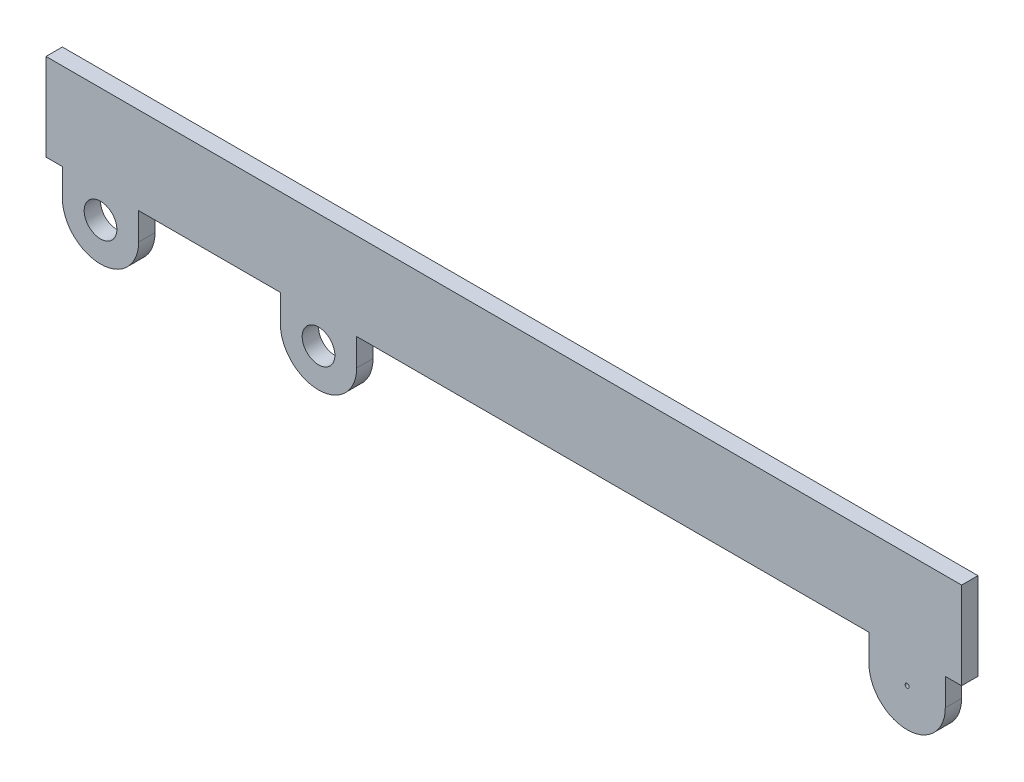
ISO-10303-21;
HEADER;
FILE_DESCRIPTION(('STEP AP214'),'2;1');
FILE_NAME('part.step','',(''),(''),'','','');
FILE_SCHEMA(('AUTOMOTIVE_DESIGN { 1 0 10303 214 1 1 1 1 }'));
ENDSEC;
DATA;
#1=APPLICATION_CONTEXT('core data for automotive mechanical design processes');
#2=APPLICATION_PROTOCOL_DEFINITION('international standard','automotive_design',2000,#1);
#3=PRODUCT_CONTEXT('',#1,'mechanical');
#4=PRODUCT('Part','Part','',(#3));
#5=PRODUCT_RELATED_PRODUCT_CATEGORY('part','',(#4));
#6=PRODUCT_DEFINITION_FORMATION('','',#4);
#7=PRODUCT_DEFINITION_CONTEXT('part definition',#1,'design');
#8=PRODUCT_DEFINITION('design','',#6,#7);
#9=PRODUCT_DEFINITION_SHAPE('','',#8);
#10=(LENGTH_UNIT() NAMED_UNIT(*) SI_UNIT(.MILLI.,.METRE.));
#11=(NAMED_UNIT(*) PLANE_ANGLE_UNIT() SI_UNIT($,.RADIAN.));
#12=(NAMED_UNIT(*) SI_UNIT($,.STERADIAN.) SOLID_ANGLE_UNIT());
#13=UNCERTAINTY_MEASURE_WITH_UNIT(LENGTH_MEASURE(1.E-05),#10,'distance_accuracy_value','');
#14=(GEOMETRIC_REPRESENTATION_CONTEXT(3) GLOBAL_UNCERTAINTY_ASSIGNED_CONTEXT((#13)) GLOBAL_UNIT_ASSIGNED_CONTEXT((#10,
#11,#12)) REPRESENTATION_CONTEXT('',''));
#15=CARTESIAN_POINT('',(0.,0.,0.));
#16=DIRECTION('',(0.,0.,1.));
#17=DIRECTION('',(1.,0.,0.));
#18=AXIS2_PLACEMENT_3D('',#15,#16,#17);
#19=CARTESIAN_POINT('',(469.9,-82.5500000000001,-117.08821460762));
#20=DIRECTION('',(0.,0.,1.));
#21=DIRECTION('',(1.,0.,0.));
#22=AXIS2_PLACEMENT_3D('',#19,#20,#21);
#23=CYLINDRICAL_SURFACE('',#22,2.38125);
#24=CARTESIAN_POINT('',(469.9,-82.5500000000001,19.05));
#25=DIRECTION('',(0.,0.,1.));
#26=DIRECTION('',(1.,0.,0.));
#27=AXIS2_PLACEMENT_3D('',#24,#25,#26);
#28=CIRCLE('',#27,2.38125);
#29=CARTESIAN_POINT('',(472.28125,-82.5500000000001,19.05));
#30=VERTEX_POINT('',#29);
#31=EDGE_CURVE('E212',#30,#30,#28,.T.);
#32=ORIENTED_EDGE('',*,*,#31,.T.);
#33=EDGE_LOOP('',(#32));
#34=FACE_BOUND('',#33,.T.);
#35=CARTESIAN_POINT('',(469.9,-82.5500000000001,9.52499999999999));
#36=DIRECTION('',(0.,0.,-1.));
#37=DIRECTION('',(-1.,0.,0.));
#38=AXIS2_PLACEMENT_3D('',#35,#36,#37);
#39=CIRCLE('',#38,2.38125);
#40=CARTESIAN_POINT('',(467.51875,-82.5500000000001,9.52499999999999));
#41=VERTEX_POINT('',#40);
#42=EDGE_CURVE('E43',#41,#41,#39,.F.);
#43=ORIENTED_EDGE('',*,*,#42,.F.);
#44=EDGE_LOOP('',(#43));
#45=FACE_BOUND('',#44,.T.);
#46=ADVANCED_FACE('F39',(#34,#45),#23,.F.);
#47=CARTESIAN_POINT('',(-533.4,-50.8,19.05));
#48=DIRECTION('',(0.,1.,0.));
#49=DIRECTION('',(0.,0.,1.));
#50=AXIS2_PLACEMENT_3D('',#47,#48,#49);
#51=PLANE('',#50);
#52=DIRECTION('',(1.,0.,0.));
#53=VECTOR('',#52,1.);
#54=CARTESIAN_POINT('',(-533.4,-50.8,0.));
#55=LINE('',#54,#53);
#56=CARTESIAN_POINT('',(-425.45,-50.8,0.));
#57=VERTEX_POINT('',#56);
#58=CARTESIAN_POINT('',(-260.35,-50.8,0.));
#59=VERTEX_POINT('',#58);
#60=EDGE_CURVE('E316',#57,#59,#55,.T.);
#61=ORIENTED_EDGE('',*,*,#60,.T.);
#62=DIRECTION('',(0.,0.,1.));
#63=VECTOR('',#62,1.);
#64=CARTESIAN_POINT('',(-260.35,-50.8,-117.08821460762));
#65=LINE('',#64,#63);
#66=CARTESIAN_POINT('',(-260.35,-50.8,19.05));
#67=VERTEX_POINT('',#66);
#68=EDGE_CURVE('E64',#59,#67,#65,.T.);
#69=ORIENTED_EDGE('',*,*,#68,.T.);
#70=DIRECTION('',(1.,0.,0.));
#71=VECTOR('',#70,1.);
#72=CARTESIAN_POINT('',(-533.4,-50.8,19.05));
#73=LINE('',#72,#71);
#74=CARTESIAN_POINT('',(-425.45,-50.8,19.05));
#75=VERTEX_POINT('',#74);
#76=EDGE_CURVE('E302',#75,#67,#73,.T.);
#77=ORIENTED_EDGE('',*,*,#76,.F.);
#78=DIRECTION('',(0.,0.,1.));
#79=VECTOR('',#78,1.);
#80=CARTESIAN_POINT('',(-425.45,-50.8,-117.08821460762));
#81=LINE('',#80,#79);
#82=EDGE_CURVE('E267',#57,#75,#81,.T.);
#83=ORIENTED_EDGE('',*,*,#82,.F.);
#84=EDGE_LOOP('',(#61,#69,#77,#83));
#85=FACE_BOUND('',#84,.T.);
#86=ADVANCED_FACE('F367',(#85),#51,.F.);
#87=CARTESIAN_POINT('',(514.35,-50.8,19.05));
#88=VERTEX_POINT('',#87);
#89=CARTESIAN_POINT('',(533.4,-50.8,19.05));
#90=VERTEX_POINT('',#89);
#91=EDGE_CURVE('E296',#88,#90,#73,.T.);
#92=ORIENTED_EDGE('',*,*,#91,.F.);
#93=DIRECTION('',(0.,0.,1.));
#94=VECTOR('',#93,1.);
#95=CARTESIAN_POINT('',(514.35,-50.8,-117.08821460762));
#96=LINE('',#95,#94);
#97=CARTESIAN_POINT('',(514.35,-50.8,0.));
#98=VERTEX_POINT('',#97);
#99=EDGE_CURVE('E221',#98,#88,#96,.T.);
#100=ORIENTED_EDGE('',*,*,#99,.F.);
#101=CARTESIAN_POINT('',(533.4,-50.8,0.));
#102=VERTEX_POINT('',#101);
#103=EDGE_CURVE('E312',#98,#102,#55,.T.);
#104=ORIENTED_EDGE('',*,*,#103,.T.);
#105=DIRECTION('',(0.,0.,-1.));
#106=VECTOR('',#105,1.);
#107=CARTESIAN_POINT('',(533.4,-50.8,19.05));
#108=LINE('',#107,#106);
#109=EDGE_CURVE('E301',#90,#102,#108,.T.);
#110=ORIENTED_EDGE('',*,*,#109,.F.);
#111=EDGE_LOOP('',(#92,#100,#104,#110));
#112=FACE_BOUND('',#111,.T.);
#113=ADVANCED_FACE('F350',(#112),#51,.F.);
#114=CARTESIAN_POINT('',(-171.45,-50.8,19.05));
#115=VERTEX_POINT('',#114);
#116=CARTESIAN_POINT('',(425.45,-50.8,19.05));
#117=VERTEX_POINT('',#116);
#118=EDGE_CURVE('E56',#115,#117,#73,.T.);
#119=ORIENTED_EDGE('',*,*,#118,.F.);
#120=DIRECTION('',(0.,0.,1.));
#121=VECTOR('',#120,1.);
#122=CARTESIAN_POINT('',(-171.45,-50.8,-117.08821460762));
#123=LINE('',#122,#121);
#124=CARTESIAN_POINT('',(-171.45,-50.8,0.));
#125=VERTEX_POINT('',#124);
#126=EDGE_CURVE('E168',#125,#115,#123,.T.);
#127=ORIENTED_EDGE('',*,*,#126,.F.);
#128=CARTESIAN_POINT('',(425.45,-50.8,0.));
#129=VERTEX_POINT('',#128);
#130=EDGE_CURVE('E165',#125,#129,#55,.T.);
#131=ORIENTED_EDGE('',*,*,#130,.T.);
#132=DIRECTION('',(0.,0.,1.));
#133=VECTOR('',#132,1.);
#134=CARTESIAN_POINT('',(425.45,-50.8,-117.08821460762));
#135=LINE('',#134,#133);
#136=EDGE_CURVE('E216',#129,#117,#135,.T.);
#137=ORIENTED_EDGE('',*,*,#136,.T.);
#138=EDGE_LOOP('',(#119,#127,#131,#137));
#139=FACE_BOUND('',#138,.T.);
#140=ADVANCED_FACE('F362',(#139),#51,.F.);
#141=CARTESIAN_POINT('',(533.4,-50.8,19.05));
#142=DIRECTION('',(-1.,0.,0.));
#143=DIRECTION('',(0.,0.,1.));
#144=AXIS2_PLACEMENT_3D('',#141,#142,#143);
#145=PLANE('',#144);
#146=DIRECTION('',(0.,1.,0.));
#147=VECTOR('',#146,1.);
#148=CARTESIAN_POINT('',(533.4,-50.8,0.));
#149=LINE('',#148,#147);
#150=CARTESIAN_POINT('',(533.4,50.8,0.));
#151=VERTEX_POINT('',#150);
#152=EDGE_CURVE('E262',#102,#151,#149,.T.);
#153=ORIENTED_EDGE('',*,*,#152,.T.);
#154=DIRECTION('',(0.,0.,-1.));
#155=VECTOR('',#154,1.);
#156=CARTESIAN_POINT('',(533.4,50.8,19.05));
#157=LINE('',#156,#155);
#158=CARTESIAN_POINT('',(533.4,50.8,19.05));
#159=VERTEX_POINT('',#158);
#160=EDGE_CURVE('E11',#159,#151,#157,.T.);
#161=ORIENTED_EDGE('',*,*,#160,.F.);
#162=DIRECTION('',(0.,1.,0.));
#163=VECTOR('',#162,1.);
#164=CARTESIAN_POINT('',(533.4,-50.8,19.05));
#165=LINE('',#164,#163);
#166=EDGE_CURVE('E285',#90,#159,#165,.T.);
#167=ORIENTED_EDGE('',*,*,#166,.F.);
#168=ORIENTED_EDGE('',*,*,#109,.T.);
#169=EDGE_LOOP('',(#153,#161,#167,#168));
#170=FACE_BOUND('',#169,.T.);
#171=ADVANCED_FACE('F41',(#170),#145,.F.);
#172=CARTESIAN_POINT('',(-533.4,50.8,19.05));
#173=DIRECTION('',(0.,-1.,0.));
#174=DIRECTION('',(0.,0.,-1.));
#175=AXIS2_PLACEMENT_3D('',#172,#173,#174);
#176=PLANE('',#175);
#177=DIRECTION('',(-1.,0.,0.));
#178=VECTOR('',#177,1.);
#179=CARTESIAN_POINT('',(-533.4,50.8,0.));
#180=LINE('',#179,#178);
#181=CARTESIAN_POINT('',(-533.4,50.8,0.));
#182=VERTEX_POINT('',#181);
#183=EDGE_CURVE('E306',#151,#182,#180,.T.);
#184=ORIENTED_EDGE('',*,*,#183,.T.);
#185=DIRECTION('',(0.,0.,-1.));
#186=VECTOR('',#185,1.);
#187=CARTESIAN_POINT('',(-533.4,50.8,19.05));
#188=LINE('',#187,#186);
#189=CARTESIAN_POINT('',(-533.4,50.8,19.05));
#190=VERTEX_POINT('',#189);
#191=EDGE_CURVE('E49',#190,#182,#188,.T.);
#192=ORIENTED_EDGE('',*,*,#191,.F.);
#193=DIRECTION('',(-1.,0.,0.));
#194=VECTOR('',#193,1.);
#195=CARTESIAN_POINT('',(-533.4,50.8,19.05));
#196=LINE('',#195,#194);
#197=EDGE_CURVE('E289',#159,#190,#196,.T.);
#198=ORIENTED_EDGE('',*,*,#197,.F.);
#199=ORIENTED_EDGE('',*,*,#160,.T.);
#200=EDGE_LOOP('',(#184,#192,#198,#199));
#201=FACE_BOUND('',#200,.T.);
#202=ADVANCED_FACE('F343',(#201),#176,.F.);
#203=CARTESIAN_POINT('',(-533.4,-50.8,19.05));
#204=DIRECTION('',(1.,0.,0.));
#205=DIRECTION('',(0.,0.,-1.));
#206=AXIS2_PLACEMENT_3D('',#203,#204,#205);
#207=PLANE('',#206);
#208=DIRECTION('',(0.,-1.,0.));
#209=VECTOR('',#208,1.);
#210=CARTESIAN_POINT('',(-533.4,-50.8,0.));
#211=LINE('',#210,#209);
#212=CARTESIAN_POINT('',(-533.4,-50.8,0.));
#213=VERTEX_POINT('',#212);
#214=EDGE_CURVE('E309',#182,#213,#211,.T.);
#215=ORIENTED_EDGE('',*,*,#214,.T.);
#216=DIRECTION('',(0.,0.,-1.));
#217=VECTOR('',#216,1.);
#218=CARTESIAN_POINT('',(-533.4,-50.8,19.05));
#219=LINE('',#218,#217);
#220=CARTESIAN_POINT('',(-533.4,-50.8,19.05));
#221=VERTEX_POINT('',#220);
#222=EDGE_CURVE('E320',#221,#213,#219,.T.);
#223=ORIENTED_EDGE('',*,*,#222,.F.);
#224=DIRECTION('',(0.,-1.,0.));
#225=VECTOR('',#224,1.);
#226=CARTESIAN_POINT('',(-533.4,-50.8,19.05));
#227=LINE('',#226,#225);
#228=EDGE_CURVE('E293',#190,#221,#227,.T.);
#229=ORIENTED_EDGE('',*,*,#228,.F.);
#230=ORIENTED_EDGE('',*,*,#191,.T.);
#231=EDGE_LOOP('',(#215,#223,#229,#230));
#232=FACE_BOUND('',#231,.T.);
#233=ADVANCED_FACE('F330',(#232),#207,.F.);
#234=CARTESIAN_POINT('',(-514.35,-50.8,0.));
#235=VERTEX_POINT('',#234);
#236=EDGE_CURVE('E290',#213,#235,#55,.T.);
#237=ORIENTED_EDGE('',*,*,#236,.T.);
#238=DIRECTION('',(0.,0.,1.));
#239=VECTOR('',#238,1.);
#240=CARTESIAN_POINT('',(-514.35,-50.8,-117.08821460762));
#241=LINE('',#240,#239);
#242=CARTESIAN_POINT('',(-514.35,-50.8,19.05));
#243=VERTEX_POINT('',#242);
#244=EDGE_CURVE('E275',#235,#243,#241,.T.);
#245=ORIENTED_EDGE('',*,*,#244,.T.);
#246=EDGE_CURVE('E297',#221,#243,#73,.T.);
#247=ORIENTED_EDGE('',*,*,#246,.F.);
#248=ORIENTED_EDGE('',*,*,#222,.T.);
#249=EDGE_LOOP('',(#237,#245,#247,#248));
#250=FACE_BOUND('',#249,.T.);
#251=ADVANCED_FACE('F336',(#250),#51,.F.);
#252=CARTESIAN_POINT('',(0.,0.,19.05));
#253=DIRECTION('',(0.,0.,-1.));
#254=DIRECTION('',(-1.,0.,0.));
#255=AXIS2_PLACEMENT_3D('',#252,#253,#254);
#256=PLANE('',#255);
#257=ORIENTED_EDGE('',*,*,#166,.T.);
#258=ORIENTED_EDGE('',*,*,#197,.T.);
#259=ORIENTED_EDGE('',*,*,#228,.T.);
#260=ORIENTED_EDGE('',*,*,#246,.T.);
#261=DIRECTION('',(0.,-1.,0.));
#262=VECTOR('',#261,1.);
#263=CARTESIAN_POINT('',(-514.35,-50.8,19.05));
#264=LINE('',#263,#262);
#265=CARTESIAN_POINT('',(-514.35,-82.5500000000001,19.05));
#266=VERTEX_POINT('',#265);
#267=EDGE_CURVE('E250',#243,#266,#264,.T.);
#268=ORIENTED_EDGE('',*,*,#267,.T.);
#269=CARTESIAN_POINT('',(-469.9,-82.5500000000001,19.05));
#270=DIRECTION('',(0.,0.,1.));
#271=DIRECTION('',(1.,0.,0.));
#272=AXIS2_PLACEMENT_3D('',#269,#270,#271);
#273=CIRCLE('',#272,44.45);
#274=CARTESIAN_POINT('',(-425.45,-82.5500000000001,19.05));
#275=VERTEX_POINT('',#274);
#276=EDGE_CURVE('E246',#266,#275,#273,.T.);
#277=ORIENTED_EDGE('',*,*,#276,.T.);
#278=DIRECTION('',(0.,1.,0.));
#279=VECTOR('',#278,1.);
#280=CARTESIAN_POINT('',(-425.45,-50.8,19.05));
#281=LINE('',#280,#279);
#282=EDGE_CURVE('E241',#275,#75,#281,.T.);
#283=ORIENTED_EDGE('',*,*,#282,.T.);
#284=ORIENTED_EDGE('',*,*,#76,.T.);
#285=DIRECTION('',(0.,-1.,0.));
#286=VECTOR('',#285,1.);
#287=CARTESIAN_POINT('',(-260.35,-50.8,19.05));
#288=LINE('',#287,#286);
#289=CARTESIAN_POINT('',(-260.35,-82.5500000000001,19.05));
#290=VERTEX_POINT('',#289);
#291=EDGE_CURVE('E372',#67,#290,#288,.T.);
#292=ORIENTED_EDGE('',*,*,#291,.T.);
#293=CARTESIAN_POINT('',(-215.9,-82.5500000000001,19.05));
#294=DIRECTION('',(0.,0.,1.));
#295=DIRECTION('',(1.,0.,0.));
#296=AXIS2_PLACEMENT_3D('',#293,#294,#295);
#297=CIRCLE('',#296,44.45);
#298=CARTESIAN_POINT('',(-171.45,-82.5500000000001,19.05));
#299=VERTEX_POINT('',#298);
#300=EDGE_CURVE('E374',#290,#299,#297,.T.);
#301=ORIENTED_EDGE('',*,*,#300,.T.);
#302=DIRECTION('',(0.,1.,0.));
#303=VECTOR('',#302,1.);
#304=CARTESIAN_POINT('',(-171.45,-50.8,19.05));
#305=LINE('',#304,#303);
#306=EDGE_CURVE('E174',#299,#115,#305,.T.);
#307=ORIENTED_EDGE('',*,*,#306,.T.);
#308=ORIENTED_EDGE('',*,*,#118,.T.);
#309=DIRECTION('',(0.,-1.,0.));
#310=VECTOR('',#309,1.);
#311=CARTESIAN_POINT('',(425.45,-50.8,19.05));
#312=LINE('',#311,#310);
#313=CARTESIAN_POINT('',(425.45,-82.5500000000001,19.05));
#314=VERTEX_POINT('',#313);
#315=EDGE_CURVE('E204',#117,#314,#312,.T.);
#316=ORIENTED_EDGE('',*,*,#315,.T.);
#317=CARTESIAN_POINT('',(469.9,-82.5500000000001,19.05));
#318=DIRECTION('',(0.,0.,1.));
#319=DIRECTION('',(-1.,0.,0.));
#320=AXIS2_PLACEMENT_3D('',#317,#318,#319);
#321=CIRCLE('',#320,44.45);
#322=CARTESIAN_POINT('',(514.35,-82.5500000000001,19.05));
#323=VERTEX_POINT('',#322);
#324=EDGE_CURVE('E199',#314,#323,#321,.T.);
#325=ORIENTED_EDGE('',*,*,#324,.T.);
#326=DIRECTION('',(0.,1.,0.));
#327=VECTOR('',#326,1.);
#328=CARTESIAN_POINT('',(514.35,-50.8,19.05));
#329=LINE('',#328,#327);
#330=EDGE_CURVE('E208',#323,#88,#329,.T.);
#331=ORIENTED_EDGE('',*,*,#330,.T.);
#332=ORIENTED_EDGE('',*,*,#91,.T.);
#333=EDGE_LOOP('',(#257,#258,#259,#260,#268,#277,#283,#284,#292,#301,#307,#308,#316,#325,#331,#332));
#334=FACE_BOUND('',#333,.T.);
#335=CARTESIAN_POINT('',(-469.9,-82.5500000000001,19.05));
#336=DIRECTION('',(0.,0.,1.));
#337=DIRECTION('',(1.,0.,0.));
#338=AXIS2_PLACEMENT_3D('',#335,#336,#337);
#339=CIRCLE('',#338,19.05);
#340=CARTESIAN_POINT('',(-450.85,-82.5500000000001,19.05));
#341=VERTEX_POINT('',#340);
#342=EDGE_CURVE('E254',#341,#341,#339,.T.);
#343=ORIENTED_EDGE('',*,*,#342,.F.);
#344=EDGE_LOOP('',(#343));
#345=FACE_BOUND('',#344,.T.);
#346=ORIENTED_EDGE('',*,*,#31,.F.);
#347=EDGE_LOOP('',(#346));
#348=FACE_BOUND('',#347,.T.);
#349=CARTESIAN_POINT('',(-215.9,-82.5500000000001,19.05));
#350=DIRECTION('',(0.,0.,1.));
#351=DIRECTION('',(1.,0.,0.));
#352=AXIS2_PLACEMENT_3D('',#349,#350,#351);
#353=CIRCLE('',#352,19.05);
#354=CARTESIAN_POINT('',(-196.85,-82.5500000000001,19.05));
#355=VERTEX_POINT('',#354);
#356=EDGE_CURVE('E179',#355,#355,#353,.T.);
#357=ORIENTED_EDGE('',*,*,#356,.F.);
#358=EDGE_LOOP('',(#357));
#359=FACE_BOUND('',#358,.T.);
#360=ADVANCED_FACE('F339',(#334,#345,#348,#359),#256,.F.);
#361=CARTESIAN_POINT('',(0.,0.,0.));
#362=DIRECTION('',(0.,0.,-1.));
#363=DIRECTION('',(-1.,0.,0.));
#364=AXIS2_PLACEMENT_3D('',#361,#362,#363);
#365=PLANE('',#364);
#366=CARTESIAN_POINT('',(469.9,-82.5500000000001,0.));
#367=DIRECTION('',(0.,0.,-1.));
#368=DIRECTION('',(-1.,0.,0.));
#369=AXIS2_PLACEMENT_3D('',#366,#367,#368);
#370=CIRCLE('',#369,19.05);
#371=CARTESIAN_POINT('',(450.85,-82.5500000000001,0.));
#372=VERTEX_POINT('',#371);
#373=EDGE_CURVE('E383',#372,#372,#370,.T.);
#374=ORIENTED_EDGE('',*,*,#373,.F.);
#375=EDGE_LOOP('',(#374));
#376=FACE_BOUND('',#375,.T.);
#377=ORIENTED_EDGE('',*,*,#152,.F.);
#378=ORIENTED_EDGE('',*,*,#103,.F.);
#379=DIRECTION('',(0.,1.,0.));
#380=VECTOR('',#379,1.);
#381=CARTESIAN_POINT('',(514.35,-50.8,0.));
#382=LINE('',#381,#380);
#383=CARTESIAN_POINT('',(514.35,-82.5500000000001,0.));
#384=VERTEX_POINT('',#383);
#385=EDGE_CURVE('E217',#384,#98,#382,.T.);
#386=ORIENTED_EDGE('',*,*,#385,.F.);
#387=CARTESIAN_POINT('',(469.9,-82.5500000000001,0.));
#388=DIRECTION('',(0.,0.,-1.));
#389=DIRECTION('',(-1.,0.,0.));
#390=AXIS2_PLACEMENT_3D('',#387,#388,#389);
#391=CIRCLE('',#390,44.45);
#392=CARTESIAN_POINT('',(425.45,-82.5500000000001,0.));
#393=VERTEX_POINT('',#392);
#394=EDGE_CURVE('E222',#393,#384,#391,.F.);
#395=ORIENTED_EDGE('',*,*,#394,.F.);
#396=DIRECTION('',(0.,-1.,0.));
#397=VECTOR('',#396,1.);
#398=CARTESIAN_POINT('',(425.45,-50.8,0.));
#399=LINE('',#398,#397);
#400=EDGE_CURVE('E227',#129,#393,#399,.T.);
#401=ORIENTED_EDGE('',*,*,#400,.F.);
#402=ORIENTED_EDGE('',*,*,#130,.F.);
#403=DIRECTION('',(0.,1.,0.));
#404=VECTOR('',#403,1.);
#405=CARTESIAN_POINT('',(-171.45,-50.8,0.));
#406=LINE('',#405,#404);
#407=CARTESIAN_POINT('',(-171.45,-82.5500000000001,0.));
#408=VERTEX_POINT('',#407);
#409=EDGE_CURVE('E155',#408,#125,#406,.T.);
#410=ORIENTED_EDGE('',*,*,#409,.F.);
#411=CARTESIAN_POINT('',(-215.9,-82.5500000000001,0.));
#412=DIRECTION('',(0.,0.,-1.));
#413=DIRECTION('',(-1.,0.,0.));
#414=AXIS2_PLACEMENT_3D('',#411,#412,#413);
#415=CIRCLE('',#414,44.45);
#416=CARTESIAN_POINT('',(-260.35,-82.5500000000001,0.));
#417=VERTEX_POINT('',#416);
#418=EDGE_CURVE('E162',#417,#408,#415,.F.);
#419=ORIENTED_EDGE('',*,*,#418,.F.);
#420=DIRECTION('',(0.,-1.,0.));
#421=VECTOR('',#420,1.);
#422=CARTESIAN_POINT('',(-260.35,-50.8,0.));
#423=LINE('',#422,#421);
#424=EDGE_CURVE('E192',#59,#417,#423,.T.);
#425=ORIENTED_EDGE('',*,*,#424,.F.);
#426=ORIENTED_EDGE('',*,*,#60,.F.);
#427=DIRECTION('',(0.,1.,0.));
#428=VECTOR('',#427,1.);
#429=CARTESIAN_POINT('',(-425.45,-50.8,0.));
#430=LINE('',#429,#428);
#431=CARTESIAN_POINT('',(-425.45,-82.5500000000001,0.));
#432=VERTEX_POINT('',#431);
#433=EDGE_CURVE('E272',#432,#57,#430,.T.);
#434=ORIENTED_EDGE('',*,*,#433,.F.);
#435=CARTESIAN_POINT('',(-469.9,-82.5500000000001,0.));
#436=DIRECTION('',(0.,0.,-1.));
#437=DIRECTION('',(-1.,0.,0.));
#438=AXIS2_PLACEMENT_3D('',#435,#436,#437);
#439=CIRCLE('',#438,44.45);
#440=CARTESIAN_POINT('',(-514.35,-82.5500000000001,0.));
#441=VERTEX_POINT('',#440);
#442=EDGE_CURVE('E263',#441,#432,#439,.F.);
#443=ORIENTED_EDGE('',*,*,#442,.F.);
#444=DIRECTION('',(0.,-1.,0.));
#445=VECTOR('',#444,1.);
#446=CARTESIAN_POINT('',(-514.35,-50.8,0.));
#447=LINE('',#446,#445);
#448=EDGE_CURVE('E203',#235,#441,#447,.T.);
#449=ORIENTED_EDGE('',*,*,#448,.F.);
#450=ORIENTED_EDGE('',*,*,#236,.F.);
#451=ORIENTED_EDGE('',*,*,#214,.F.);
#452=ORIENTED_EDGE('',*,*,#183,.F.);
#453=EDGE_LOOP('',(#377,#378,#386,#395,#401,#402,#410,#419,#425,#426,#434,#443,#449,#450,#451,#452));
#454=FACE_BOUND('',#453,.T.);
#455=CARTESIAN_POINT('',(-469.9,-82.5500000000001,0.));
#456=DIRECTION('',(0.,0.,-1.));
#457=DIRECTION('',(-1.,0.,0.));
#458=AXIS2_PLACEMENT_3D('',#455,#456,#457);
#459=CIRCLE('',#458,19.05);
#460=CARTESIAN_POINT('',(-488.95,-82.5500000000001,0.));
#461=VERTEX_POINT('',#460);
#462=EDGE_CURVE('E245',#461,#461,#459,.F.);
#463=ORIENTED_EDGE('',*,*,#462,.T.);
#464=EDGE_LOOP('',(#463));
#465=FACE_BOUND('',#464,.T.);
#466=CARTESIAN_POINT('',(-215.9,-82.5500000000001,0.));
#467=DIRECTION('',(0.,0.,-1.));
#468=DIRECTION('',(-1.,0.,0.));
#469=AXIS2_PLACEMENT_3D('',#466,#467,#468);
#470=CIRCLE('',#469,19.05);
#471=CARTESIAN_POINT('',(-234.95,-82.5500000000001,0.));
#472=VERTEX_POINT('',#471);
#473=EDGE_CURVE('E190',#472,#472,#470,.F.);
#474=ORIENTED_EDGE('',*,*,#473,.T.);
#475=EDGE_LOOP('',(#474));
#476=FACE_BOUND('',#475,.T.);
#477=ADVANCED_FACE('F158',(#376,#454,#465,#476),#365,.T.);
#478=CARTESIAN_POINT('',(-514.35,-50.8,-117.08821460762));
#479=DIRECTION('',(-1.,0.,0.));
#480=DIRECTION('',(0.,-1.,0.));
#481=AXIS2_PLACEMENT_3D('',#478,#479,#480);
#482=PLANE('',#481);
#483=ORIENTED_EDGE('',*,*,#244,.F.);
#484=ORIENTED_EDGE('',*,*,#448,.T.);
#485=DIRECTION('',(0.,0.,1.));
#486=VECTOR('',#485,1.);
#487=CARTESIAN_POINT('',(-514.35,-82.5500000000001,-117.08821460762));
#488=LINE('',#487,#486);
#489=EDGE_CURVE('E271',#441,#266,#488,.T.);
#490=ORIENTED_EDGE('',*,*,#489,.T.);
#491=ORIENTED_EDGE('',*,*,#267,.F.);
#492=EDGE_LOOP('',(#483,#484,#490,#491));
#493=FACE_BOUND('',#492,.T.);
#494=ADVANCED_FACE('F416',(#493),#482,.T.);
#495=CARTESIAN_POINT('',(-425.45,-50.8,-117.08821460762));
#496=DIRECTION('',(1.,0.,0.));
#497=DIRECTION('',(0.,0.,-1.));
#498=AXIS2_PLACEMENT_3D('',#495,#496,#497);
#499=PLANE('',#498);
#500=DIRECTION('',(0.,0.,1.));
#501=VECTOR('',#500,1.);
#502=CARTESIAN_POINT('',(-425.45,-82.5500000000001,-117.08821460762));
#503=LINE('',#502,#501);
#504=EDGE_CURVE('E258',#432,#275,#503,.T.);
#505=ORIENTED_EDGE('',*,*,#504,.F.);
#506=ORIENTED_EDGE('',*,*,#433,.T.);
#507=ORIENTED_EDGE('',*,*,#82,.T.);
#508=ORIENTED_EDGE('',*,*,#282,.F.);
#509=EDGE_LOOP('',(#505,#506,#507,#508));
#510=FACE_BOUND('',#509,.T.);
#511=ADVANCED_FACE('F412',(#510),#499,.T.);
#512=CARTESIAN_POINT('',(-469.9,-82.5500000000001,-117.08821460762));
#513=DIRECTION('',(0.,0.,1.));
#514=DIRECTION('',(1.,0.,0.));
#515=AXIS2_PLACEMENT_3D('',#512,#513,#514);
#516=CYLINDRICAL_SURFACE('',#515,44.45);
#517=ORIENTED_EDGE('',*,*,#489,.F.);
#518=ORIENTED_EDGE('',*,*,#442,.T.);
#519=ORIENTED_EDGE('',*,*,#504,.T.);
#520=ORIENTED_EDGE('',*,*,#276,.F.);
#521=EDGE_LOOP('',(#517,#518,#519,#520));
#522=FACE_BOUND('',#521,.T.);
#523=ADVANCED_FACE('F408',(#522),#516,.T.);
#524=CARTESIAN_POINT('',(-469.9,-82.5500000000001,-117.08821460762));
#525=DIRECTION('',(0.,0.,1.));
#526=DIRECTION('',(1.,0.,0.));
#527=AXIS2_PLACEMENT_3D('',#524,#525,#526);
#528=CYLINDRICAL_SURFACE('',#527,19.05);
#529=ORIENTED_EDGE('',*,*,#342,.T.);
#530=EDGE_LOOP('',(#529));
#531=FACE_BOUND('',#530,.T.);
#532=ORIENTED_EDGE('',*,*,#462,.F.);
#533=EDGE_LOOP('',(#532));
#534=FACE_BOUND('',#533,.T.);
#535=ADVANCED_FACE('F411',(#531,#534),#528,.F.);
#536=CARTESIAN_POINT('',(514.35,-50.8,-117.08821460762));
#537=DIRECTION('',(1.,0.,0.));
#538=DIRECTION('',(0.,0.,-1.));
#539=AXIS2_PLACEMENT_3D('',#536,#537,#538);
#540=PLANE('',#539);
#541=DIRECTION('',(0.,0.,1.));
#542=VECTOR('',#541,1.);
#543=CARTESIAN_POINT('',(514.35,-82.5500000000001,-117.08821460762));
#544=LINE('',#543,#542);
#545=EDGE_CURVE('E226',#384,#323,#544,.T.);
#546=ORIENTED_EDGE('',*,*,#545,.F.);
#547=ORIENTED_EDGE('',*,*,#385,.T.);
#548=ORIENTED_EDGE('',*,*,#99,.T.);
#549=ORIENTED_EDGE('',*,*,#330,.F.);
#550=EDGE_LOOP('',(#546,#547,#548,#549));
#551=FACE_BOUND('',#550,.T.);
#552=ADVANCED_FACE('F353',(#551),#540,.T.);
#553=CARTESIAN_POINT('',(469.9,-82.5500000000001,-117.08821460762));
#554=DIRECTION('',(0.,0.,1.));
#555=DIRECTION('',(1.,0.,0.));
#556=AXIS2_PLACEMENT_3D('',#553,#554,#555);
#557=CYLINDRICAL_SURFACE('',#556,44.45);
#558=DIRECTION('',(0.,0.,1.));
#559=VECTOR('',#558,1.);
#560=CARTESIAN_POINT('',(425.45,-82.5500000000001,-117.08821460762));
#561=LINE('',#560,#559);
#562=EDGE_CURVE('E231',#393,#314,#561,.T.);
#563=ORIENTED_EDGE('',*,*,#562,.F.);
#564=ORIENTED_EDGE('',*,*,#394,.T.);
#565=ORIENTED_EDGE('',*,*,#545,.T.);
#566=ORIENTED_EDGE('',*,*,#324,.F.);
#567=EDGE_LOOP('',(#563,#564,#565,#566));
#568=FACE_BOUND('',#567,.T.);
#569=ADVANCED_FACE('F357',(#568),#557,.T.);
#570=CARTESIAN_POINT('',(425.45,-50.8,-117.08821460762));
#571=DIRECTION('',(-1.,0.,0.));
#572=DIRECTION('',(0.,0.,1.));
#573=AXIS2_PLACEMENT_3D('',#570,#571,#572);
#574=PLANE('',#573);
#575=ORIENTED_EDGE('',*,*,#136,.F.);
#576=ORIENTED_EDGE('',*,*,#400,.T.);
#577=ORIENTED_EDGE('',*,*,#562,.T.);
#578=ORIENTED_EDGE('',*,*,#315,.F.);
#579=EDGE_LOOP('',(#575,#576,#577,#578));
#580=FACE_BOUND('',#579,.T.);
#581=ADVANCED_FACE('F361',(#580),#574,.T.);
#582=CARTESIAN_POINT('',(-260.35,-50.8,-117.08821460762));
#583=DIRECTION('',(-1.,0.,0.));
#584=DIRECTION('',(0.,-1.,0.));
#585=AXIS2_PLACEMENT_3D('',#582,#583,#584);
#586=PLANE('',#585);
#587=ORIENTED_EDGE('',*,*,#68,.F.);
#588=ORIENTED_EDGE('',*,*,#424,.T.);
#589=DIRECTION('',(0.,0.,1.));
#590=VECTOR('',#589,1.);
#591=CARTESIAN_POINT('',(-260.35,-82.5500000000001,-117.08821460762));
#592=LINE('',#591,#590);
#593=EDGE_CURVE('E183',#417,#290,#592,.T.);
#594=ORIENTED_EDGE('',*,*,#593,.T.);
#595=ORIENTED_EDGE('',*,*,#291,.F.);
#596=EDGE_LOOP('',(#587,#588,#594,#595));
#597=FACE_BOUND('',#596,.T.);
#598=ADVANCED_FACE('F370',(#597),#586,.T.);
#599=CARTESIAN_POINT('',(-171.45,-50.8,-117.08821460762));
#600=DIRECTION('',(1.,0.,0.));
#601=DIRECTION('',(0.,0.,-1.));
#602=AXIS2_PLACEMENT_3D('',#599,#600,#601);
#603=PLANE('',#602);
#604=DIRECTION('',(0.,0.,1.));
#605=VECTOR('',#604,1.);
#606=CARTESIAN_POINT('',(-171.45,-82.5500000000001,-117.08821460762));
#607=LINE('',#606,#605);
#608=EDGE_CURVE('E171',#408,#299,#607,.T.);
#609=ORIENTED_EDGE('',*,*,#608,.F.);
#610=ORIENTED_EDGE('',*,*,#409,.T.);
#611=ORIENTED_EDGE('',*,*,#126,.T.);
#612=ORIENTED_EDGE('',*,*,#306,.F.);
#613=EDGE_LOOP('',(#609,#610,#611,#612));
#614=FACE_BOUND('',#613,.T.);
#615=ADVANCED_FACE('F172',(#614),#603,.T.);
#616=CARTESIAN_POINT('',(-215.9,-82.5500000000001,-117.08821460762));
#617=DIRECTION('',(0.,0.,1.));
#618=DIRECTION('',(1.,0.,0.));
#619=AXIS2_PLACEMENT_3D('',#616,#617,#618);
#620=CYLINDRICAL_SURFACE('',#619,44.45);
#621=ORIENTED_EDGE('',*,*,#593,.F.);
#622=ORIENTED_EDGE('',*,*,#418,.T.);
#623=ORIENTED_EDGE('',*,*,#608,.T.);
#624=ORIENTED_EDGE('',*,*,#300,.F.);
#625=EDGE_LOOP('',(#621,#622,#623,#624));
#626=FACE_BOUND('',#625,.T.);
#627=ADVANCED_FACE('F182',(#626),#620,.T.);
#628=CARTESIAN_POINT('',(-215.9,-82.5500000000001,-117.08821460762));
#629=DIRECTION('',(0.,0.,1.));
#630=DIRECTION('',(1.,0.,0.));
#631=AXIS2_PLACEMENT_3D('',#628,#629,#630);
#632=CYLINDRICAL_SURFACE('',#631,19.05);
#633=ORIENTED_EDGE('',*,*,#356,.T.);
#634=EDGE_LOOP('',(#633));
#635=FACE_BOUND('',#634,.T.);
#636=ORIENTED_EDGE('',*,*,#473,.F.);
#637=EDGE_LOOP('',(#636));
#638=FACE_BOUND('',#637,.T.);
#639=ADVANCED_FACE('F527',(#635,#638),#632,.F.);
#640=CARTESIAN_POINT('',(469.9,-82.5500000000001,9.525));
#641=DIRECTION('',(0.,0.,-1.));
#642=DIRECTION('',(-1.,0.,0.));
#643=AXIS2_PLACEMENT_3D('',#640,#641,#642);
#644=PLANE('',#643);
#645=CARTESIAN_POINT('',(469.9,-82.5500000000001,9.525));
#646=DIRECTION('',(0.,0.,-1.));
#647=DIRECTION('',(-1.,0.,0.));
#648=AXIS2_PLACEMENT_3D('',#645,#646,#647);
#649=CIRCLE('',#648,19.05);
#650=CARTESIAN_POINT('',(450.85,-82.5500000000001,9.525));
#651=VERTEX_POINT('',#650);
#652=EDGE_CURVE('E387',#651,#651,#649,.T.);
#653=ORIENTED_EDGE('',*,*,#652,.T.);
#654=EDGE_LOOP('',(#653));
#655=FACE_BOUND('',#654,.T.);
#656=ORIENTED_EDGE('',*,*,#42,.T.);
#657=EDGE_LOOP('',(#656));
#658=FACE_BOUND('',#657,.T.);
#659=ADVANCED_FACE('F396',(#655,#658),#644,.T.);
#660=CARTESIAN_POINT('',(469.9,-82.5500000000001,9.525));
#661=DIRECTION('',(0.,0.,-1.));
#662=DIRECTION('',(-1.,0.,0.));
#663=AXIS2_PLACEMENT_3D('',#660,#661,#662);
#664=CYLINDRICAL_SURFACE('',#663,19.05);
#665=CARTESIAN_POINT('',(450.85,-82.5500000000001,9.525));
#666=CARTESIAN_POINT('',(450.85,-82.5500000000001,9.42578125));
#667=CARTESIAN_POINT('',(450.85,-82.5500000000001,9.3265625));
#668=CARTESIAN_POINT('',(450.85,-82.5500000000001,9.128125));
#669=CARTESIAN_POINT('',(450.85,-82.5500000000001,9.02890625));
#670=CARTESIAN_POINT('',(450.85,-82.5500000000001,8.83046875));
#671=CARTESIAN_POINT('',(450.85,-82.5500000000001,8.73125));
#672=CARTESIAN_POINT('',(450.85,-82.5500000000001,8.5328125));
#673=CARTESIAN_POINT('',(450.85,-82.5500000000001,8.43359375));
#674=CARTESIAN_POINT('',(450.85,-82.5500000000001,8.23515625));
#675=CARTESIAN_POINT('',(450.85,-82.5500000000001,8.1359375));
#676=CARTESIAN_POINT('',(450.85,-82.5500000000001,7.9375));
#677=CARTESIAN_POINT('',(450.85,-82.5500000000001,7.83828125));
#678=CARTESIAN_POINT('',(450.85,-82.5500000000001,7.63984375));
#679=CARTESIAN_POINT('',(450.85,-82.5500000000001,7.540625));
#680=CARTESIAN_POINT('',(450.85,-82.5500000000001,7.3421875));
#681=CARTESIAN_POINT('',(450.85,-82.5500000000001,7.24296875));
#682=CARTESIAN_POINT('',(450.85,-82.5500000000001,7.04453125));
#683=CARTESIAN_POINT('',(450.85,-82.5500000000001,6.9453125));
#684=CARTESIAN_POINT('',(450.85,-82.5500000000001,6.746875));
#685=CARTESIAN_POINT('',(450.85,-82.5500000000001,6.64765625));
#686=CARTESIAN_POINT('',(450.85,-82.5500000000001,6.44921875));
#687=CARTESIAN_POINT('',(450.85,-82.5500000000001,6.35));
#688=CARTESIAN_POINT('',(450.85,-82.5500000000001,6.1515625));
#689=CARTESIAN_POINT('',(450.85,-82.5500000000001,6.05234375));
#690=CARTESIAN_POINT('',(450.85,-82.5500000000001,5.85390625));
#691=CARTESIAN_POINT('',(450.85,-82.5500000000001,5.7546875));
#692=CARTESIAN_POINT('',(450.85,-82.5500000000001,5.55625));
#693=CARTESIAN_POINT('',(450.85,-82.5500000000001,5.45703125));
#694=CARTESIAN_POINT('',(450.85,-82.5500000000001,5.25859375));
#695=CARTESIAN_POINT('',(450.85,-82.5500000000001,5.159375));
#696=CARTESIAN_POINT('',(450.85,-82.5500000000001,4.9609375));
#697=CARTESIAN_POINT('',(450.85,-82.5500000000001,4.86171875));
#698=CARTESIAN_POINT('',(450.85,-82.5500000000001,4.66328125));
#699=CARTESIAN_POINT('',(450.85,-82.5500000000001,4.5640625));
#700=CARTESIAN_POINT('',(450.85,-82.5500000000001,4.365625));
#701=CARTESIAN_POINT('',(450.85,-82.5500000000001,4.26640625));
#702=CARTESIAN_POINT('',(450.85,-82.5500000000001,4.06796875));
#703=CARTESIAN_POINT('',(450.85,-82.5500000000001,3.96875));
#704=CARTESIAN_POINT('',(450.85,-82.5500000000001,3.7703125));
#705=CARTESIAN_POINT('',(450.85,-82.5500000000001,3.67109375));
#706=CARTESIAN_POINT('',(450.85,-82.5500000000001,3.47265625));
#707=CARTESIAN_POINT('',(450.85,-82.5500000000001,3.3734375));
#708=CARTESIAN_POINT('',(450.85,-82.5500000000001,3.175));
#709=CARTESIAN_POINT('',(450.85,-82.5500000000001,3.07578125));
#710=CARTESIAN_POINT('',(450.85,-82.5500000000001,2.87734375));
#711=CARTESIAN_POINT('',(450.85,-82.5500000000001,2.778125));
#712=CARTESIAN_POINT('',(450.85,-82.5500000000001,2.5796875));
#713=CARTESIAN_POINT('',(450.85,-82.5500000000001,2.48046875));
#714=CARTESIAN_POINT('',(450.85,-82.5500000000001,2.28203125));
#715=CARTESIAN_POINT('',(450.85,-82.5500000000001,2.1828125));
#716=CARTESIAN_POINT('',(450.85,-82.5500000000001,1.984375));
#717=CARTESIAN_POINT('',(450.85,-82.5500000000001,1.88515625));
#718=CARTESIAN_POINT('',(450.85,-82.5500000000001,1.68671875));
#719=CARTESIAN_POINT('',(450.85,-82.5500000000001,1.5875));
#720=CARTESIAN_POINT('',(450.85,-82.5500000000001,1.3890625));
#721=CARTESIAN_POINT('',(450.85,-82.5500000000001,1.28984375));
#722=CARTESIAN_POINT('',(450.85,-82.5500000000001,1.09140625));
#723=CARTESIAN_POINT('',(450.85,-82.5500000000001,0.992187500000001));
#724=CARTESIAN_POINT('',(450.85,-82.5500000000001,0.793750000000001));
#725=CARTESIAN_POINT('',(450.85,-82.5500000000001,0.69453125));
#726=CARTESIAN_POINT('',(450.85,-82.5500000000001,0.49609375));
#727=CARTESIAN_POINT('',(450.85,-82.5500000000001,0.396875));
#728=CARTESIAN_POINT('',(450.85,-82.5500000000001,0.1984375));
#729=CARTESIAN_POINT('',(450.85,-82.5500000000001,0.0992187500000001));
#730=CARTESIAN_POINT('',(450.85,-82.5500000000001,0.));
#731=B_SPLINE_CURVE_WITH_KNOTS('',3,(#665,#666,#667,#668,#669,#670,#671,#672,#673,#674,#675,
#676,#677,#678,#679,#680,#681,#682,#683,#684,#685,#686,#687,#688,#689,#690,#691,#692,#693,#694,
#695,#696,#697,#698,#699,#700,#701,#702,#703,#704,#705,#706,#707,#708,#709,#710,#711,#712,#713,
#714,#715,#716,#717,#718,#719,#720,#721,#722,#723,#724,#725,#726,#727,#728,#729,#730),
.UNSPECIFIED.,.F.,.F.,(4,2,2,2,2,2,2,2,2,2,2,2,2,2,2,2,2,2,2,2,2,2,2,2,2,2,2,2,2,2,2,2,4),(0.,
0.29765625,0.5953125,0.892968750000001,1.190625,1.48828125,1.7859375,2.08359375,2.38125,
2.67890625,2.9765625,3.27421875,3.571875,3.86953125,4.1671875,4.46484375,4.7625,5.06015625,
5.3578125,5.65546875,5.953125,6.25078125,6.5484375,6.84609375,7.14375,7.44140625,7.7390625,
8.03671875,8.334375,8.63203125,8.9296875,9.22734375,9.525),.UNSPECIFIED.);
#732=EDGE_CURVE('BSEAM540',#651,#372,#731,.T.);
#733=ORIENTED_EDGE('',*,*,#652,.F.);
#734=ORIENTED_EDGE('',*,*,#373,.T.);
#735=ORIENTED_EDGE('',*,*,#732,.T.);
#736=ORIENTED_EDGE('',*,*,#732,.F.);
#737=EDGE_LOOP('',(#733,#735,#734,#736));
#738=FACE_BOUND('',#737,.T.);
#739=ADVANCED_FACE('F540',(#738),#664,.F.);
#740=CLOSED_SHELL('',(#46,#86,#113,#140,#171,#202,#233,#251,#360,#477,#494,#511,#523,#535,#552,
#569,#581,#598,#615,#627,#639,#659,#739));
#741=MANIFOLD_SOLID_BREP('B2',#740);
#742=ADVANCED_BREP_SHAPE_REPRESENTATION('',(#18,#741),#14);
#743=SHAPE_DEFINITION_REPRESENTATION(#9,#742);
ENDSEC;
END-ISO-10303-21;
